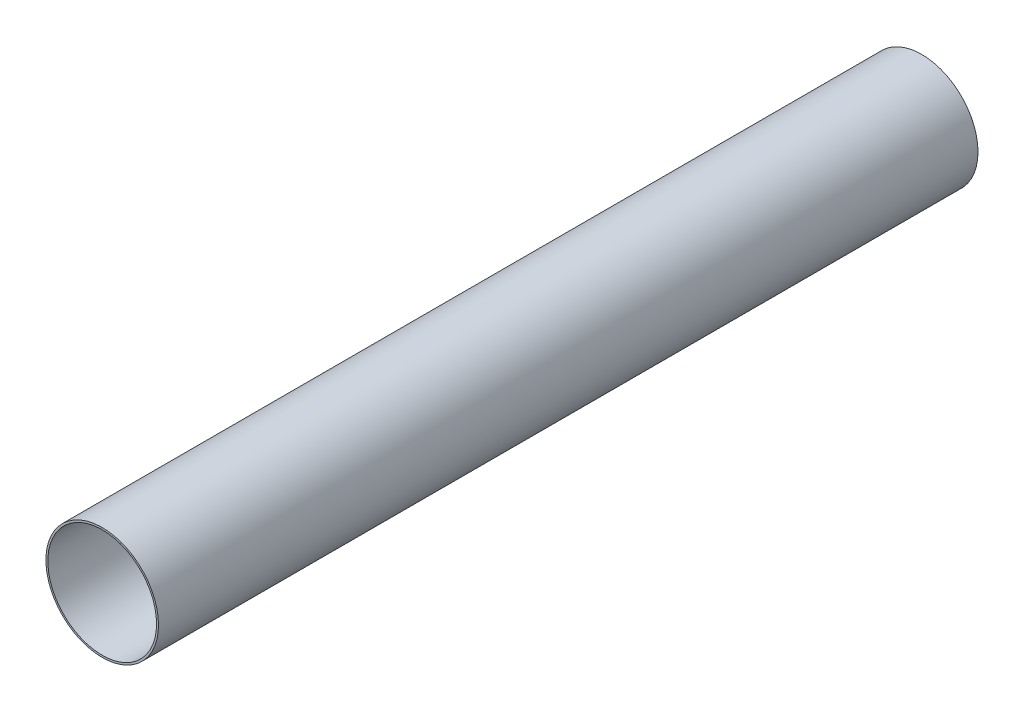
ISO-10303-21;
HEADER;
FILE_DESCRIPTION(('STEP AP214'),'2;1');
FILE_NAME('part.step','',(''),(''),'','','');
FILE_SCHEMA(('AUTOMOTIVE_DESIGN { 1 0 10303 214 1 1 1 1 }'));
ENDSEC;
DATA;
#1=APPLICATION_CONTEXT('core data for automotive mechanical design processes');
#2=APPLICATION_PROTOCOL_DEFINITION('international standard','automotive_design',2000,#1);
#3=PRODUCT_CONTEXT('',#1,'mechanical');
#4=PRODUCT('Part','Part','',(#3));
#5=PRODUCT_RELATED_PRODUCT_CATEGORY('part','',(#4));
#6=PRODUCT_DEFINITION_FORMATION('','',#4);
#7=PRODUCT_DEFINITION_CONTEXT('part definition',#1,'design');
#8=PRODUCT_DEFINITION('design','',#6,#7);
#9=PRODUCT_DEFINITION_SHAPE('','',#8);
#10=(LENGTH_UNIT() NAMED_UNIT(*) SI_UNIT(.MILLI.,.METRE.));
#11=(NAMED_UNIT(*) PLANE_ANGLE_UNIT() SI_UNIT($,.RADIAN.));
#12=(NAMED_UNIT(*) SI_UNIT($,.STERADIAN.) SOLID_ANGLE_UNIT());
#13=UNCERTAINTY_MEASURE_WITH_UNIT(LENGTH_MEASURE(1.E-05),#10,'distance_accuracy_value','');
#14=(GEOMETRIC_REPRESENTATION_CONTEXT(3) GLOBAL_UNCERTAINTY_ASSIGNED_CONTEXT((#13)) GLOBAL_UNIT_ASSIGNED_CONTEXT((#10,
#11,#12)) REPRESENTATION_CONTEXT('',''));
#15=CARTESIAN_POINT('',(0.,0.,0.));
#16=DIRECTION('',(0.,0.,1.));
#17=DIRECTION('',(1.,0.,0.));
#18=AXIS2_PLACEMENT_3D('',#15,#16,#17);
#19=CARTESIAN_POINT('',(0.,0.,1150.));
#20=DIRECTION('',(0.,0.,1.));
#21=DIRECTION('',(1.,0.,0.));
#22=AXIS2_PLACEMENT_3D('',#19,#20,#21);
#23=PLANE('',#22);
#24=CARTESIAN_POINT('',(0.,0.,1150.));
#25=DIRECTION('',(0.,0.,1.));
#26=DIRECTION('',(1.,0.,0.));
#27=AXIS2_PLACEMENT_3D('',#24,#25,#26);
#28=CIRCLE('',#27,79.);
#29=CARTESIAN_POINT('',(79.,0.,1150.));
#30=VERTEX_POINT('',#29);
#31=EDGE_CURVE('E11',#30,#30,#28,.T.);
#32=ORIENTED_EDGE('',*,*,#31,.T.);
#33=EDGE_LOOP('',(#32));
#34=FACE_BOUND('',#33,.T.);
#35=CARTESIAN_POINT('',(0.,0.,1150.));
#36=DIRECTION('',(0.,0.,1.));
#37=DIRECTION('',(1.,0.,0.));
#38=AXIS2_PLACEMENT_3D('',#35,#36,#37);
#39=CIRCLE('',#38,76.29);
#40=CARTESIAN_POINT('',(76.29,0.,1150.));
#41=VERTEX_POINT('',#40);
#42=EDGE_CURVE('E52',#41,#41,#39,.T.);
#43=ORIENTED_EDGE('',*,*,#42,.F.);
#44=EDGE_LOOP('',(#43));
#45=FACE_BOUND('',#44,.T.);
#46=ADVANCED_FACE('F41',(#34,#45),#23,.T.);
#47=CARTESIAN_POINT('',(0.,0.,0.));
#48=DIRECTION('',(0.,0.,1.));
#49=DIRECTION('',(1.,0.,0.));
#50=AXIS2_PLACEMENT_3D('',#47,#48,#49);
#51=PLANE('',#50);
#52=CARTESIAN_POINT('',(0.,0.,0.));
#53=DIRECTION('',(0.,0.,1.));
#54=DIRECTION('',(1.,0.,0.));
#55=AXIS2_PLACEMENT_3D('',#52,#53,#54);
#56=CIRCLE('',#55,79.);
#57=CARTESIAN_POINT('',(79.,0.,0.));
#58=VERTEX_POINT('',#57);
#59=EDGE_CURVE('E45',#58,#58,#56,.T.);
#60=ORIENTED_EDGE('',*,*,#59,.F.);
#61=EDGE_LOOP('',(#60));
#62=FACE_BOUND('',#61,.T.);
#63=CARTESIAN_POINT('',(0.,0.,0.));
#64=DIRECTION('',(0.,0.,1.));
#65=DIRECTION('',(1.,0.,0.));
#66=AXIS2_PLACEMENT_3D('',#63,#64,#65);
#67=CIRCLE('',#66,76.29);
#68=CARTESIAN_POINT('',(76.29,0.,0.));
#69=VERTEX_POINT('',#68);
#70=EDGE_CURVE('E54',#69,#69,#67,.T.);
#71=ORIENTED_EDGE('',*,*,#70,.T.);
#72=EDGE_LOOP('',(#71));
#73=FACE_BOUND('',#72,.T.);
#74=ADVANCED_FACE('F64',(#62,#73),#51,.F.);
#75=CARTESIAN_POINT('',(0.,0.,1150.));
#76=DIRECTION('',(0.,0.,-1.));
#77=DIRECTION('',(-1.,0.,0.));
#78=AXIS2_PLACEMENT_3D('',#75,#76,#77);
#79=CYLINDRICAL_SURFACE('',#78,79.);
#80=ORIENTED_EDGE('',*,*,#31,.F.);
#81=EDGE_LOOP('',(#80));
#82=FACE_BOUND('',#81,.T.);
#83=ORIENTED_EDGE('',*,*,#59,.T.);
#84=EDGE_LOOP('',(#83));
#85=FACE_BOUND('',#84,.T.);
#86=ADVANCED_FACE('F43',(#82,#85),#79,.T.);
#87=CARTESIAN_POINT('',(0.,0.,1150.));
#88=DIRECTION('',(0.,0.,-1.));
#89=DIRECTION('',(-1.,0.,0.));
#90=AXIS2_PLACEMENT_3D('',#87,#88,#89);
#91=CYLINDRICAL_SURFACE('',#90,76.29);
#92=ORIENTED_EDGE('',*,*,#42,.T.);
#93=EDGE_LOOP('',(#92));
#94=FACE_BOUND('',#93,.T.);
#95=ORIENTED_EDGE('',*,*,#70,.F.);
#96=EDGE_LOOP('',(#95));
#97=FACE_BOUND('',#96,.T.);
#98=ADVANCED_FACE('F60',(#94,#97),#91,.F.);
#99=CLOSED_SHELL('',(#46,#74,#86,#98));
#100=MANIFOLD_SOLID_BREP('B2',#99);
#101=ADVANCED_BREP_SHAPE_REPRESENTATION('',(#18,#100),#14);
#102=SHAPE_DEFINITION_REPRESENTATION(#9,#101);
ENDSEC;
END-ISO-10303-21;
